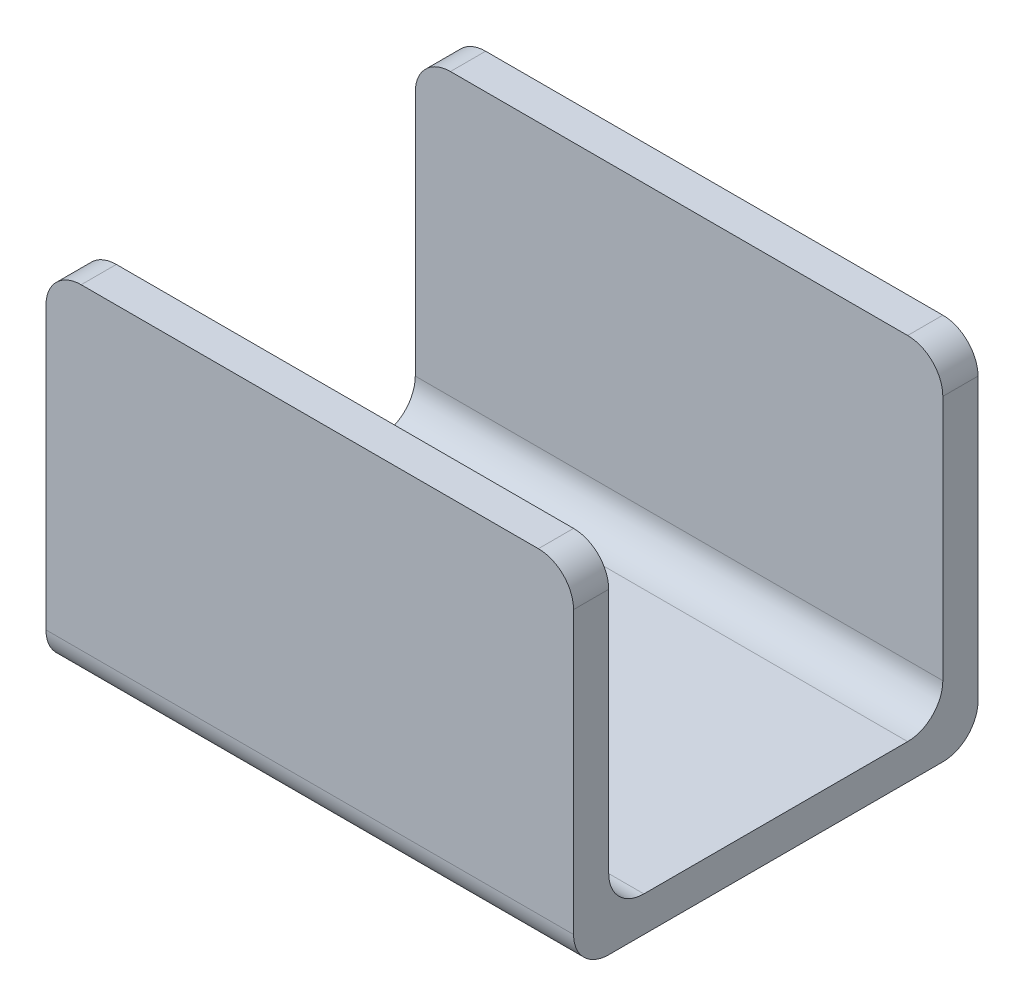
ISO-10303-21;
HEADER;
FILE_DESCRIPTION(('STEP AP214'),'2;1');
FILE_NAME('part.step','',(''),(''),'','','');
FILE_SCHEMA(('AUTOMOTIVE_DESIGN { 1 0 10303 214 1 1 1 1 }'));
ENDSEC;
DATA;
#1=APPLICATION_CONTEXT('core data for automotive mechanical design processes');
#2=APPLICATION_PROTOCOL_DEFINITION('international standard','automotive_design',2000,#1);
#3=PRODUCT_CONTEXT('',#1,'mechanical');
#4=PRODUCT('Part','Part','',(#3));
#5=PRODUCT_RELATED_PRODUCT_CATEGORY('part','',(#4));
#6=PRODUCT_DEFINITION_FORMATION('','',#4);
#7=PRODUCT_DEFINITION_CONTEXT('part definition',#1,'design');
#8=PRODUCT_DEFINITION('design','',#6,#7);
#9=PRODUCT_DEFINITION_SHAPE('','',#8);
#10=(LENGTH_UNIT() NAMED_UNIT(*) SI_UNIT(.MILLI.,.METRE.));
#11=(NAMED_UNIT(*) PLANE_ANGLE_UNIT() SI_UNIT($,.RADIAN.));
#12=(NAMED_UNIT(*) SI_UNIT($,.STERADIAN.) SOLID_ANGLE_UNIT());
#13=UNCERTAINTY_MEASURE_WITH_UNIT(LENGTH_MEASURE(1.E-05),#10,'distance_accuracy_value','');
#14=(GEOMETRIC_REPRESENTATION_CONTEXT(3) GLOBAL_UNCERTAINTY_ASSIGNED_CONTEXT((#13)) GLOBAL_UNIT_ASSIGNED_CONTEXT((#10,
#11,#12)) REPRESENTATION_CONTEXT('',''));
#15=CARTESIAN_POINT('',(0.,0.,0.));
#16=DIRECTION('',(0.,0.,1.));
#17=DIRECTION('',(1.,0.,0.));
#18=AXIS2_PLACEMENT_3D('',#15,#16,#17);
#19=CARTESIAN_POINT('',(-30.,0.,23.));
#20=DIRECTION('',(0.,0.,1.));
#21=DIRECTION('',(1.,0.,0.));
#22=AXIS2_PLACEMENT_3D('',#19,#20,#21);
#23=PLANE('',#22);
#24=DIRECTION('',(0.,-1.,0.));
#25=VECTOR('',#24,1.);
#26=CARTESIAN_POINT('',(30.,0.,23.));
#27=LINE('',#26,#25);
#28=CARTESIAN_POINT('',(30.,36.,23.));
#29=VERTEX_POINT('',#28);
#30=CARTESIAN_POINT('',(30.,3.99999999999999,23.));
#31=VERTEX_POINT('',#30);
#32=EDGE_CURVE('E154',#29,#31,#27,.T.);
#33=ORIENTED_EDGE('',*,*,#32,.F.);
#34=CARTESIAN_POINT('',(26.,36.,23.));
#35=DIRECTION('',(0.,0.,1.));
#36=DIRECTION('',(1.,0.,0.));
#37=AXIS2_PLACEMENT_3D('',#34,#35,#36);
#38=CIRCLE('',#37,4.);
#39=CARTESIAN_POINT('',(26.,40.,23.));
#40=VERTEX_POINT('',#39);
#41=EDGE_CURVE('E212',#29,#40,#38,.T.);
#42=ORIENTED_EDGE('',*,*,#41,.T.);
#43=DIRECTION('',(1.,0.,0.));
#44=VECTOR('',#43,1.);
#45=CARTESIAN_POINT('',(-30.,40.,23.));
#46=LINE('',#45,#44);
#47=CARTESIAN_POINT('',(-26.,40.,23.));
#48=VERTEX_POINT('',#47);
#49=EDGE_CURVE('E168',#48,#40,#46,.T.);
#50=ORIENTED_EDGE('',*,*,#49,.F.);
#51=CARTESIAN_POINT('',(-26.,36.,23.));
#52=DIRECTION('',(0.,0.,1.));
#53=DIRECTION('',(1.,0.,0.));
#54=AXIS2_PLACEMENT_3D('',#51,#52,#53);
#55=CIRCLE('',#54,4.);
#56=CARTESIAN_POINT('',(-30.,36.,23.));
#57=VERTEX_POINT('',#56);
#58=EDGE_CURVE('E210',#48,#57,#55,.T.);
#59=ORIENTED_EDGE('',*,*,#58,.T.);
#60=DIRECTION('',(0.,-1.,0.));
#61=VECTOR('',#60,1.);
#62=CARTESIAN_POINT('',(-30.,0.,23.));
#63=LINE('',#62,#61);
#64=CARTESIAN_POINT('',(-30.,3.99999999999999,23.));
#65=VERTEX_POINT('',#64);
#66=EDGE_CURVE('E257',#57,#65,#63,.T.);
#67=ORIENTED_EDGE('',*,*,#66,.T.);
#68=DIRECTION('',(1.,0.,0.));
#69=VECTOR('',#68,1.);
#70=CARTESIAN_POINT('',(-30.,3.99999999999999,23.));
#71=LINE('',#70,#69);
#72=EDGE_CURVE('E180',#65,#31,#71,.T.);
#73=ORIENTED_EDGE('',*,*,#72,.T.);
#74=EDGE_LOOP('',(#33,#42,#50,#59,#67,#73));
#75=FACE_BOUND('',#74,.T.);
#76=ADVANCED_FACE('F33',(#75),#23,.T.);
#77=CARTESIAN_POINT('',(-30.,40.,23.));
#78=DIRECTION('',(0.,1.,0.));
#79=DIRECTION('',(0.,0.,1.));
#80=AXIS2_PLACEMENT_3D('',#77,#78,#79);
#81=PLANE('',#80);
#82=ORIENTED_EDGE('',*,*,#49,.T.);
#83=DIRECTION('',(0.,0.,1.));
#84=VECTOR('',#83,1.);
#85=CARTESIAN_POINT('',(26.,40.,19.));
#86=LINE('',#85,#84);
#87=CARTESIAN_POINT('',(26.,40.,19.));
#88=VERTEX_POINT('',#87);
#89=EDGE_CURVE('E217',#40,#88,#86,.F.);
#90=ORIENTED_EDGE('',*,*,#89,.T.);
#91=DIRECTION('',(1.,0.,0.));
#92=VECTOR('',#91,1.);
#93=CARTESIAN_POINT('',(-30.,40.,19.));
#94=LINE('',#93,#92);
#95=CARTESIAN_POINT('',(-26.,40.,19.));
#96=VERTEX_POINT('',#95);
#97=EDGE_CURVE('E171',#96,#88,#94,.T.);
#98=ORIENTED_EDGE('',*,*,#97,.F.);
#99=DIRECTION('',(0.,0.,1.));
#100=VECTOR('',#99,1.);
#101=CARTESIAN_POINT('',(-26.,40.,23.));
#102=LINE('',#101,#100);
#103=EDGE_CURVE('E214',#96,#48,#102,.T.);
#104=ORIENTED_EDGE('',*,*,#103,.T.);
#105=EDGE_LOOP('',(#82,#90,#98,#104));
#106=FACE_BOUND('',#105,.T.);
#107=ADVANCED_FACE('F316',(#106),#81,.T.);
#108=CARTESIAN_POINT('',(-30.,40.,19.));
#109=DIRECTION('',(0.,0.,-1.));
#110=DIRECTION('',(0.,1.,0.));
#111=AXIS2_PLACEMENT_3D('',#108,#109,#110);
#112=PLANE('',#111);
#113=DIRECTION('',(0.,1.,0.));
#114=VECTOR('',#113,1.);
#115=CARTESIAN_POINT('',(30.,40.,19.));
#116=LINE('',#115,#114);
#117=CARTESIAN_POINT('',(30.,7.99999999999999,19.));
#118=VERTEX_POINT('',#117);
#119=CARTESIAN_POINT('',(30.,36.,19.));
#120=VERTEX_POINT('',#119);
#121=EDGE_CURVE('E253',#118,#120,#116,.T.);
#122=ORIENTED_EDGE('',*,*,#121,.F.);
#123=DIRECTION('',(1.,0.,0.));
#124=VECTOR('',#123,1.);
#125=CARTESIAN_POINT('',(-30.,7.99999999999999,19.));
#126=LINE('',#125,#124);
#127=CARTESIAN_POINT('',(-30.,7.99999999999999,19.));
#128=VERTEX_POINT('',#127);
#129=EDGE_CURVE('E230',#118,#128,#126,.F.);
#130=ORIENTED_EDGE('',*,*,#129,.T.);
#131=DIRECTION('',(0.,1.,0.));
#132=VECTOR('',#131,1.);
#133=CARTESIAN_POINT('',(-30.,40.,19.));
#134=LINE('',#133,#132);
#135=CARTESIAN_POINT('',(-30.,36.,19.));
#136=VERTEX_POINT('',#135);
#137=EDGE_CURVE('E266',#128,#136,#134,.T.);
#138=ORIENTED_EDGE('',*,*,#137,.T.);
#139=CARTESIAN_POINT('',(-26.,36.,19.));
#140=DIRECTION('',(0.,0.,-1.));
#141=DIRECTION('',(0.,1.,0.));
#142=AXIS2_PLACEMENT_3D('',#139,#140,#141);
#143=CIRCLE('',#142,4.);
#144=EDGE_CURVE('E219',#136,#96,#143,.T.);
#145=ORIENTED_EDGE('',*,*,#144,.T.);
#146=ORIENTED_EDGE('',*,*,#97,.T.);
#147=CARTESIAN_POINT('',(26.,36.,19.));
#148=DIRECTION('',(0.,0.,-1.));
#149=DIRECTION('',(0.,1.,0.));
#150=AXIS2_PLACEMENT_3D('',#147,#148,#149);
#151=CIRCLE('',#150,4.);
#152=EDGE_CURVE('E221',#88,#120,#151,.T.);
#153=ORIENTED_EDGE('',*,*,#152,.T.);
#154=EDGE_LOOP('',(#122,#130,#138,#145,#146,#153));
#155=FACE_BOUND('',#154,.T.);
#156=ADVANCED_FACE('F321',(#155),#112,.T.);
#157=CARTESIAN_POINT('',(-30.,3.99999999999999,19.));
#158=DIRECTION('',(0.,1.,0.));
#159=DIRECTION('',(0.,0.,1.));
#160=AXIS2_PLACEMENT_3D('',#157,#158,#159);
#161=PLANE('',#160);
#162=DIRECTION('',(0.,0.,1.));
#163=VECTOR('',#162,1.);
#164=CARTESIAN_POINT('',(30.,3.99999999999999,19.));
#165=LINE('',#164,#163);
#166=CARTESIAN_POINT('',(30.,3.99999999999999,-15.));
#167=VERTEX_POINT('',#166);
#168=CARTESIAN_POINT('',(30.,3.99999999999999,15.));
#169=VERTEX_POINT('',#168);
#170=EDGE_CURVE('E251',#167,#169,#165,.T.);
#171=ORIENTED_EDGE('',*,*,#170,.F.);
#172=DIRECTION('',(1.,0.,0.));
#173=VECTOR('',#172,1.);
#174=CARTESIAN_POINT('',(-30.,3.99999999999999,-15.));
#175=LINE('',#174,#173);
#176=CARTESIAN_POINT('',(-30.,3.99999999999999,-15.));
#177=VERTEX_POINT('',#176);
#178=EDGE_CURVE('E54',#167,#177,#175,.F.);
#179=ORIENTED_EDGE('',*,*,#178,.T.);
#180=DIRECTION('',(0.,0.,1.));
#181=VECTOR('',#180,1.);
#182=CARTESIAN_POINT('',(-30.,3.99999999999999,19.));
#183=LINE('',#182,#181);
#184=CARTESIAN_POINT('',(-30.,3.99999999999999,15.));
#185=VERTEX_POINT('',#184);
#186=EDGE_CURVE('E270',#177,#185,#183,.T.);
#187=ORIENTED_EDGE('',*,*,#186,.T.);
#188=DIRECTION('',(1.,0.,0.));
#189=VECTOR('',#188,1.);
#190=CARTESIAN_POINT('',(30.,3.99999999999999,15.));
#191=LINE('',#190,#189);
#192=EDGE_CURVE('E227',#185,#169,#191,.T.);
#193=ORIENTED_EDGE('',*,*,#192,.T.);
#194=EDGE_LOOP('',(#171,#179,#187,#193));
#195=FACE_BOUND('',#194,.T.);
#196=ADVANCED_FACE('F400',(#195),#161,.T.);
#197=CARTESIAN_POINT('',(-30.,3.99999999999999,-19.));
#198=DIRECTION('',(0.,0.,1.));
#199=DIRECTION('',(1.,0.,0.));
#200=AXIS2_PLACEMENT_3D('',#197,#198,#199);
#201=PLANE('',#200);
#202=DIRECTION('',(0.,-1.,0.));
#203=VECTOR('',#202,1.);
#204=CARTESIAN_POINT('',(-30.,3.99999999999999,-19.));
#205=LINE('',#204,#203);
#206=CARTESIAN_POINT('',(-30.,36.,-19.));
#207=VERTEX_POINT('',#206);
#208=CARTESIAN_POINT('',(-30.,7.99999999999999,-19.));
#209=VERTEX_POINT('',#208);
#210=EDGE_CURVE('E247',#207,#209,#205,.T.);
#211=ORIENTED_EDGE('',*,*,#210,.T.);
#212=DIRECTION('',(1.,0.,0.));
#213=VECTOR('',#212,1.);
#214=CARTESIAN_POINT('',(30.,7.99999999999999,-19.));
#215=LINE('',#214,#213);
#216=CARTESIAN_POINT('',(30.,7.99999999999999,-19.));
#217=VERTEX_POINT('',#216);
#218=EDGE_CURVE('E237',#209,#217,#215,.T.);
#219=ORIENTED_EDGE('',*,*,#218,.T.);
#220=DIRECTION('',(0.,-1.,0.));
#221=VECTOR('',#220,1.);
#222=CARTESIAN_POINT('',(30.,3.99999999999999,-19.));
#223=LINE('',#222,#221);
#224=CARTESIAN_POINT('',(30.,36.,-19.));
#225=VERTEX_POINT('',#224);
#226=EDGE_CURVE('E245',#225,#217,#223,.T.);
#227=ORIENTED_EDGE('',*,*,#226,.F.);
#228=CARTESIAN_POINT('',(26.,36.,-19.));
#229=DIRECTION('',(0.,0.,1.));
#230=DIRECTION('',(1.,0.,0.));
#231=AXIS2_PLACEMENT_3D('',#228,#229,#230);
#232=CIRCLE('',#231,4.);
#233=CARTESIAN_POINT('',(26.,40.,-19.));
#234=VERTEX_POINT('',#233);
#235=EDGE_CURVE('E201',#225,#234,#232,.T.);
#236=ORIENTED_EDGE('',*,*,#235,.T.);
#237=DIRECTION('',(1.,0.,0.));
#238=VECTOR('',#237,1.);
#239=CARTESIAN_POINT('',(-30.,40.,-19.));
#240=LINE('',#239,#238);
#241=CARTESIAN_POINT('',(-26.,40.,-19.));
#242=VERTEX_POINT('',#241);
#243=EDGE_CURVE('E260',#242,#234,#240,.T.);
#244=ORIENTED_EDGE('',*,*,#243,.F.);
#245=CARTESIAN_POINT('',(-26.,36.,-19.));
#246=DIRECTION('',(0.,0.,1.));
#247=DIRECTION('',(1.,0.,0.));
#248=AXIS2_PLACEMENT_3D('',#245,#246,#247);
#249=CIRCLE('',#248,4.);
#250=EDGE_CURVE('E192',#242,#207,#249,.T.);
#251=ORIENTED_EDGE('',*,*,#250,.T.);
#252=EDGE_LOOP('',(#211,#219,#227,#236,#244,#251));
#253=FACE_BOUND('',#252,.T.);
#254=ADVANCED_FACE('F244',(#253),#201,.T.);
#255=CARTESIAN_POINT('',(-30.,40.,-19.));
#256=DIRECTION('',(0.,1.,0.));
#257=DIRECTION('',(0.,0.,1.));
#258=AXIS2_PLACEMENT_3D('',#255,#256,#257);
#259=PLANE('',#258);
#260=ORIENTED_EDGE('',*,*,#243,.T.);
#261=DIRECTION('',(0.,0.,1.));
#262=VECTOR('',#261,1.);
#263=CARTESIAN_POINT('',(26.,40.,-23.));
#264=LINE('',#263,#262);
#265=CARTESIAN_POINT('',(26.,40.,-23.));
#266=VERTEX_POINT('',#265);
#267=EDGE_CURVE('E203',#234,#266,#264,.F.);
#268=ORIENTED_EDGE('',*,*,#267,.T.);
#269=DIRECTION('',(1.,0.,0.));
#270=VECTOR('',#269,1.);
#271=CARTESIAN_POINT('',(-30.,40.,-23.));
#272=LINE('',#271,#270);
#273=CARTESIAN_POINT('',(-26.,40.,-23.));
#274=VERTEX_POINT('',#273);
#275=EDGE_CURVE('E174',#274,#266,#272,.T.);
#276=ORIENTED_EDGE('',*,*,#275,.F.);
#277=DIRECTION('',(0.,0.,1.));
#278=VECTOR('',#277,1.);
#279=CARTESIAN_POINT('',(-26.,40.,-19.));
#280=LINE('',#279,#278);
#281=EDGE_CURVE('E189',#274,#242,#280,.T.);
#282=ORIENTED_EDGE('',*,*,#281,.T.);
#283=EDGE_LOOP('',(#260,#268,#276,#282));
#284=FACE_BOUND('',#283,.T.);
#285=ADVANCED_FACE('F301',(#284),#259,.T.);
#286=CARTESIAN_POINT('',(-30.,40.,-23.));
#287=DIRECTION('',(0.,0.,-1.));
#288=DIRECTION('',(0.,1.,0.));
#289=AXIS2_PLACEMENT_3D('',#286,#287,#288);
#290=PLANE('',#289);
#291=ORIENTED_EDGE('',*,*,#275,.T.);
#292=CARTESIAN_POINT('',(26.,36.,-23.));
#293=DIRECTION('',(0.,0.,-1.));
#294=DIRECTION('',(0.,1.,0.));
#295=AXIS2_PLACEMENT_3D('',#292,#293,#294);
#296=CIRCLE('',#295,4.);
#297=CARTESIAN_POINT('',(30.,36.,-23.));
#298=VERTEX_POINT('',#297);
#299=EDGE_CURVE('E205',#266,#298,#296,.T.);
#300=ORIENTED_EDGE('',*,*,#299,.T.);
#301=DIRECTION('',(0.,1.,0.));
#302=VECTOR('',#301,1.);
#303=CARTESIAN_POINT('',(30.,40.,-23.));
#304=LINE('',#303,#302);
#305=CARTESIAN_POINT('',(30.,4.,-23.));
#306=VERTEX_POINT('',#305);
#307=EDGE_CURVE('E153',#306,#298,#304,.T.);
#308=ORIENTED_EDGE('',*,*,#307,.F.);
#309=DIRECTION('',(1.,0.,0.));
#310=VECTOR('',#309,1.);
#311=CARTESIAN_POINT('',(-30.,4.,-23.));
#312=LINE('',#311,#310);
#313=CARTESIAN_POINT('',(-30.,4.,-23.));
#314=VERTEX_POINT('',#313);
#315=EDGE_CURVE('E162',#306,#314,#312,.F.);
#316=ORIENTED_EDGE('',*,*,#315,.T.);
#317=DIRECTION('',(0.,1.,0.));
#318=VECTOR('',#317,1.);
#319=CARTESIAN_POINT('',(-30.,40.,-23.));
#320=LINE('',#319,#318);
#321=CARTESIAN_POINT('',(-30.,36.,-23.));
#322=VERTEX_POINT('',#321);
#323=EDGE_CURVE('E291',#314,#322,#320,.T.);
#324=ORIENTED_EDGE('',*,*,#323,.T.);
#325=CARTESIAN_POINT('',(-26.,36.,-23.));
#326=DIRECTION('',(0.,0.,-1.));
#327=DIRECTION('',(0.,1.,0.));
#328=AXIS2_PLACEMENT_3D('',#325,#326,#327);
#329=CIRCLE('',#328,4.);
#330=EDGE_CURVE('E196',#322,#274,#329,.T.);
#331=ORIENTED_EDGE('',*,*,#330,.T.);
#332=EDGE_LOOP('',(#291,#300,#308,#316,#324,#331));
#333=FACE_BOUND('',#332,.T.);
#334=ADVANCED_FACE('F296',(#333),#290,.T.);
#335=CARTESIAN_POINT('',(-30.,0.,-23.));
#336=DIRECTION('',(0.,-1.,0.));
#337=DIRECTION('',(0.,0.,-1.));
#338=AXIS2_PLACEMENT_3D('',#335,#336,#337);
#339=PLANE('',#338);
#340=DIRECTION('',(0.,0.,-1.));
#341=VECTOR('',#340,1.);
#342=CARTESIAN_POINT('',(30.,0.,-23.));
#343=LINE('',#342,#341);
#344=CARTESIAN_POINT('',(30.,0.,19.));
#345=VERTEX_POINT('',#344);
#346=CARTESIAN_POINT('',(30.,0.,-19.));
#347=VERTEX_POINT('',#346);
#348=EDGE_CURVE('E142',#345,#347,#343,.T.);
#349=ORIENTED_EDGE('',*,*,#348,.F.);
#350=DIRECTION('',(1.,0.,0.));
#351=VECTOR('',#350,1.);
#352=CARTESIAN_POINT('',(-30.,0.,19.));
#353=LINE('',#352,#351);
#354=CARTESIAN_POINT('',(-30.,0.,19.));
#355=VERTEX_POINT('',#354);
#356=EDGE_CURVE('E184',#345,#355,#353,.F.);
#357=ORIENTED_EDGE('',*,*,#356,.T.);
#358=DIRECTION('',(0.,0.,-1.));
#359=VECTOR('',#358,1.);
#360=CARTESIAN_POINT('',(-30.,0.,-23.));
#361=LINE('',#360,#359);
#362=CARTESIAN_POINT('',(-30.,0.,-19.));
#363=VERTEX_POINT('',#362);
#364=EDGE_CURVE('E166',#355,#363,#361,.T.);
#365=ORIENTED_EDGE('',*,*,#364,.T.);
#366=DIRECTION('',(1.,0.,0.));
#367=VECTOR('',#366,1.);
#368=CARTESIAN_POINT('',(-30.,0.,-19.));
#369=LINE('',#368,#367);
#370=EDGE_CURVE('E161',#363,#347,#369,.T.);
#371=ORIENTED_EDGE('',*,*,#370,.T.);
#372=EDGE_LOOP('',(#349,#357,#365,#371));
#373=FACE_BOUND('',#372,.T.);
#374=ADVANCED_FACE('F164',(#373),#339,.T.);
#375=CARTESIAN_POINT('',(-30.,0.,0.));
#376=DIRECTION('',(-1.,0.,0.));
#377=DIRECTION('',(0.,0.,1.));
#378=AXIS2_PLACEMENT_3D('',#375,#376,#377);
#379=PLANE('',#378);
#380=ORIENTED_EDGE('',*,*,#66,.F.);
#381=DIRECTION('',(0.,0.,1.));
#382=VECTOR('',#381,1.);
#383=CARTESIAN_POINT('',(-30.,36.,0.));
#384=LINE('',#383,#382);
#385=EDGE_CURVE('E224',#57,#136,#384,.F.);
#386=ORIENTED_EDGE('',*,*,#385,.T.);
#387=ORIENTED_EDGE('',*,*,#137,.F.);
#388=CARTESIAN_POINT('',(-30.,7.99999999999999,15.));
#389=DIRECTION('',(-1.,0.,0.));
#390=DIRECTION('',(0.,0.,1.));
#391=AXIS2_PLACEMENT_3D('',#388,#389,#390);
#392=CIRCLE('',#391,4.);
#393=EDGE_CURVE('E234',#128,#185,#392,.F.);
#394=ORIENTED_EDGE('',*,*,#393,.T.);
#395=ORIENTED_EDGE('',*,*,#186,.F.);
#396=CARTESIAN_POINT('',(-30.,7.99999999999999,-15.));
#397=DIRECTION('',(-1.,0.,0.));
#398=DIRECTION('',(0.,0.,1.));
#399=AXIS2_PLACEMENT_3D('',#396,#397,#398);
#400=CIRCLE('',#399,4.);
#401=EDGE_CURVE('E11',#177,#209,#400,.F.);
#402=ORIENTED_EDGE('',*,*,#401,.T.);
#403=ORIENTED_EDGE('',*,*,#210,.F.);
#404=DIRECTION('',(0.,0.,1.));
#405=VECTOR('',#404,1.);
#406=CARTESIAN_POINT('',(-30.,36.,0.));
#407=LINE('',#406,#405);
#408=EDGE_CURVE('E194',#207,#322,#407,.F.);
#409=ORIENTED_EDGE('',*,*,#408,.T.);
#410=ORIENTED_EDGE('',*,*,#323,.F.);
#411=CARTESIAN_POINT('',(-30.,4.,-19.));
#412=DIRECTION('',(-1.,0.,0.));
#413=DIRECTION('',(0.,0.,1.));
#414=AXIS2_PLACEMENT_3D('',#411,#412,#413);
#415=CIRCLE('',#414,4.);
#416=EDGE_CURVE('E178',#314,#363,#415,.T.);
#417=ORIENTED_EDGE('',*,*,#416,.T.);
#418=ORIENTED_EDGE('',*,*,#364,.F.);
#419=CARTESIAN_POINT('',(-30.,3.99999999999999,19.));
#420=DIRECTION('',(-1.,0.,0.));
#421=DIRECTION('',(0.,0.,1.));
#422=AXIS2_PLACEMENT_3D('',#419,#420,#421);
#423=CIRCLE('',#422,4.);
#424=EDGE_CURVE('E186',#355,#65,#423,.T.);
#425=ORIENTED_EDGE('',*,*,#424,.T.);
#426=EDGE_LOOP('',(#380,#386,#387,#394,#395,#402,#403,#409,#410,#417,#418,#425));
#427=FACE_BOUND('',#426,.T.);
#428=ADVANCED_FACE('F289',(#427),#379,.T.);
#429=CARTESIAN_POINT('',(30.,0.,0.));
#430=DIRECTION('',(-1.,0.,0.));
#431=DIRECTION('',(0.,0.,1.));
#432=AXIS2_PLACEMENT_3D('',#429,#430,#431);
#433=PLANE('',#432);
#434=ORIENTED_EDGE('',*,*,#226,.T.);
#435=CARTESIAN_POINT('',(30.,7.99999999999999,-15.));
#436=DIRECTION('',(-1.,0.,0.));
#437=DIRECTION('',(0.,0.,1.));
#438=AXIS2_PLACEMENT_3D('',#435,#436,#437);
#439=CIRCLE('',#438,4.);
#440=EDGE_CURVE('E41',#217,#167,#439,.T.);
#441=ORIENTED_EDGE('',*,*,#440,.T.);
#442=ORIENTED_EDGE('',*,*,#170,.T.);
#443=CARTESIAN_POINT('',(30.,7.99999999999999,15.));
#444=DIRECTION('',(-1.,0.,0.));
#445=DIRECTION('',(0.,0.,1.));
#446=AXIS2_PLACEMENT_3D('',#443,#444,#445);
#447=CIRCLE('',#446,4.);
#448=EDGE_CURVE('E232',#169,#118,#447,.T.);
#449=ORIENTED_EDGE('',*,*,#448,.T.);
#450=ORIENTED_EDGE('',*,*,#121,.T.);
#451=DIRECTION('',(0.,0.,1.));
#452=VECTOR('',#451,1.);
#453=CARTESIAN_POINT('',(30.,36.,23.));
#454=LINE('',#453,#452);
#455=EDGE_CURVE('E207',#120,#29,#454,.T.);
#456=ORIENTED_EDGE('',*,*,#455,.T.);
#457=ORIENTED_EDGE('',*,*,#32,.T.);
#458=CARTESIAN_POINT('',(30.,3.99999999999999,19.));
#459=DIRECTION('',(-1.,0.,0.));
#460=DIRECTION('',(0.,0.,1.));
#461=AXIS2_PLACEMENT_3D('',#458,#459,#460);
#462=CIRCLE('',#461,4.);
#463=EDGE_CURVE('E149',#31,#345,#462,.F.);
#464=ORIENTED_EDGE('',*,*,#463,.T.);
#465=ORIENTED_EDGE('',*,*,#348,.T.);
#466=CARTESIAN_POINT('',(30.,4.,-19.));
#467=DIRECTION('',(-1.,0.,0.));
#468=DIRECTION('',(0.,0.,1.));
#469=AXIS2_PLACEMENT_3D('',#466,#467,#468);
#470=CIRCLE('',#469,4.);
#471=EDGE_CURVE('E146',#347,#306,#470,.F.);
#472=ORIENTED_EDGE('',*,*,#471,.T.);
#473=ORIENTED_EDGE('',*,*,#307,.T.);
#474=DIRECTION('',(0.,0.,1.));
#475=VECTOR('',#474,1.);
#476=CARTESIAN_POINT('',(30.,36.,-19.));
#477=LINE('',#476,#475);
#478=EDGE_CURVE('E198',#298,#225,#477,.T.);
#479=ORIENTED_EDGE('',*,*,#478,.T.);
#480=EDGE_LOOP('',(#434,#441,#442,#449,#450,#456,#457,#464,#465,#472,#473,#479));
#481=FACE_BOUND('',#480,.T.);
#482=ADVANCED_FACE('F144',(#481),#433,.F.);
#483=CARTESIAN_POINT('',(-30.,4.,-19.));
#484=DIRECTION('',(1.,0.,0.));
#485=DIRECTION('',(0.,0.,-1.));
#486=AXIS2_PLACEMENT_3D('',#483,#484,#485);
#487=CYLINDRICAL_SURFACE('',#486,4.);
#488=ORIENTED_EDGE('',*,*,#416,.F.);
#489=ORIENTED_EDGE('',*,*,#315,.F.);
#490=ORIENTED_EDGE('',*,*,#471,.F.);
#491=ORIENTED_EDGE('',*,*,#370,.F.);
#492=EDGE_LOOP('',(#488,#489,#490,#491));
#493=FACE_BOUND('',#492,.T.);
#494=ADVANCED_FACE('F160',(#493),#487,.T.);
#495=CARTESIAN_POINT('',(-30.,3.99999999999999,19.));
#496=DIRECTION('',(1.,0.,0.));
#497=DIRECTION('',(0.,0.,-1.));
#498=AXIS2_PLACEMENT_3D('',#495,#496,#497);
#499=CYLINDRICAL_SURFACE('',#498,4.);
#500=ORIENTED_EDGE('',*,*,#424,.F.);
#501=ORIENTED_EDGE('',*,*,#356,.F.);
#502=ORIENTED_EDGE('',*,*,#463,.F.);
#503=ORIENTED_EDGE('',*,*,#72,.F.);
#504=EDGE_LOOP('',(#500,#501,#502,#503));
#505=FACE_BOUND('',#504,.T.);
#506=ADVANCED_FACE('F283',(#505),#499,.T.);
#507=CARTESIAN_POINT('',(-26.,36.,-19.));
#508=DIRECTION('',(0.,0.,1.));
#509=DIRECTION('',(1.,0.,0.));
#510=AXIS2_PLACEMENT_3D('',#507,#508,#509);
#511=CYLINDRICAL_SURFACE('',#510,4.);
#512=ORIENTED_EDGE('',*,*,#330,.F.);
#513=ORIENTED_EDGE('',*,*,#408,.F.);
#514=ORIENTED_EDGE('',*,*,#250,.F.);
#515=ORIENTED_EDGE('',*,*,#281,.F.);
#516=EDGE_LOOP('',(#512,#513,#514,#515));
#517=FACE_BOUND('',#516,.T.);
#518=ADVANCED_FACE('F300',(#517),#511,.T.);
#519=CARTESIAN_POINT('',(26.,36.,0.));
#520=DIRECTION('',(0.,0.,-1.));
#521=DIRECTION('',(-1.,0.,0.));
#522=AXIS2_PLACEMENT_3D('',#519,#520,#521);
#523=CYLINDRICAL_SURFACE('',#522,4.);
#524=ORIENTED_EDGE('',*,*,#299,.F.);
#525=ORIENTED_EDGE('',*,*,#267,.F.);
#526=ORIENTED_EDGE('',*,*,#235,.F.);
#527=ORIENTED_EDGE('',*,*,#478,.F.);
#528=EDGE_LOOP('',(#524,#525,#526,#527));
#529=FACE_BOUND('',#528,.T.);
#530=ADVANCED_FACE('F303',(#529),#523,.T.);
#531=CARTESIAN_POINT('',(26.,36.,0.));
#532=DIRECTION('',(0.,0.,-1.));
#533=DIRECTION('',(-1.,0.,0.));
#534=AXIS2_PLACEMENT_3D('',#531,#532,#533);
#535=CYLINDRICAL_SURFACE('',#534,4.);
#536=ORIENTED_EDGE('',*,*,#152,.F.);
#537=ORIENTED_EDGE('',*,*,#89,.F.);
#538=ORIENTED_EDGE('',*,*,#41,.F.);
#539=ORIENTED_EDGE('',*,*,#455,.F.);
#540=EDGE_LOOP('',(#536,#537,#538,#539));
#541=FACE_BOUND('',#540,.T.);
#542=ADVANCED_FACE('F305',(#541),#535,.T.);
#543=CARTESIAN_POINT('',(-26.,36.,23.));
#544=DIRECTION('',(0.,0.,1.));
#545=DIRECTION('',(1.,0.,0.));
#546=AXIS2_PLACEMENT_3D('',#543,#544,#545);
#547=CYLINDRICAL_SURFACE('',#546,4.);
#548=ORIENTED_EDGE('',*,*,#144,.F.);
#549=ORIENTED_EDGE('',*,*,#385,.F.);
#550=ORIENTED_EDGE('',*,*,#58,.F.);
#551=ORIENTED_EDGE('',*,*,#103,.F.);
#552=EDGE_LOOP('',(#548,#549,#550,#551));
#553=FACE_BOUND('',#552,.T.);
#554=ADVANCED_FACE('F311',(#553),#547,.T.);
#555=CARTESIAN_POINT('',(-30.,7.99999999999999,15.));
#556=DIRECTION('',(-1.,0.,0.));
#557=DIRECTION('',(0.,0.,1.));
#558=AXIS2_PLACEMENT_3D('',#555,#556,#557);
#559=CYLINDRICAL_SURFACE('',#558,4.);
#560=ORIENTED_EDGE('',*,*,#393,.F.);
#561=ORIENTED_EDGE('',*,*,#129,.F.);
#562=ORIENTED_EDGE('',*,*,#448,.F.);
#563=ORIENTED_EDGE('',*,*,#192,.F.);
#564=EDGE_LOOP('',(#560,#561,#562,#563));
#565=FACE_BOUND('',#564,.T.);
#566=ADVANCED_FACE('F390',(#565),#559,.F.);
#567=CARTESIAN_POINT('',(-30.,7.99999999999999,-15.));
#568=DIRECTION('',(-1.,0.,0.));
#569=DIRECTION('',(0.,0.,1.));
#570=AXIS2_PLACEMENT_3D('',#567,#568,#569);
#571=CYLINDRICAL_SURFACE('',#570,4.);
#572=ORIENTED_EDGE('',*,*,#401,.F.);
#573=ORIENTED_EDGE('',*,*,#178,.F.);
#574=ORIENTED_EDGE('',*,*,#440,.F.);
#575=ORIENTED_EDGE('',*,*,#218,.F.);
#576=EDGE_LOOP('',(#572,#573,#574,#575));
#577=FACE_BOUND('',#576,.T.);
#578=ADVANCED_FACE('F35',(#577),#571,.F.);
#579=CLOSED_SHELL('',(#76,#107,#156,#196,#254,#285,#334,#374,#428,#482,#494,#506,#518,#530,#542,
#554,#566,#578));
#580=MANIFOLD_SOLID_BREP('B2',#579);
#581=ADVANCED_BREP_SHAPE_REPRESENTATION('',(#18,#580),#14);
#582=SHAPE_DEFINITION_REPRESENTATION(#9,#581);
ENDSEC;
END-ISO-10303-21;
